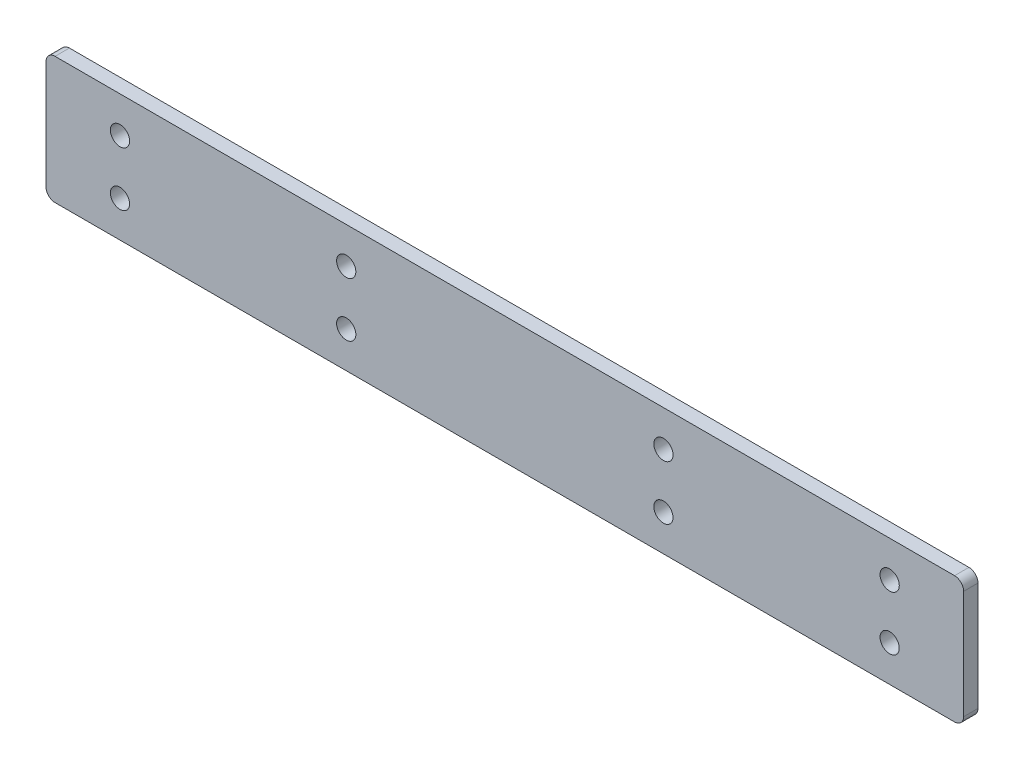
ISO-10303-21;
HEADER;
FILE_DESCRIPTION(('STEP AP214'),'2;1');
FILE_NAME('part.step','',(''),(''),'','','');
FILE_SCHEMA(('AUTOMOTIVE_DESIGN { 1 0 10303 214 1 1 1 1 }'));
ENDSEC;
DATA;
#1=APPLICATION_CONTEXT('core data for automotive mechanical design processes');
#2=APPLICATION_PROTOCOL_DEFINITION('international standard','automotive_design',2000,#1);
#3=PRODUCT_CONTEXT('',#1,'mechanical');
#4=PRODUCT('Part','Part','',(#3));
#5=PRODUCT_RELATED_PRODUCT_CATEGORY('part','',(#4));
#6=PRODUCT_DEFINITION_FORMATION('','',#4);
#7=PRODUCT_DEFINITION_CONTEXT('part definition',#1,'design');
#8=PRODUCT_DEFINITION('design','',#6,#7);
#9=PRODUCT_DEFINITION_SHAPE('','',#8);
#10=(LENGTH_UNIT() NAMED_UNIT(*) SI_UNIT(.MILLI.,.METRE.));
#11=(NAMED_UNIT(*) PLANE_ANGLE_UNIT() SI_UNIT($,.RADIAN.));
#12=(NAMED_UNIT(*) SI_UNIT($,.STERADIAN.) SOLID_ANGLE_UNIT());
#13=UNCERTAINTY_MEASURE_WITH_UNIT(LENGTH_MEASURE(1.E-05),#10,'distance_accuracy_value','');
#14=(GEOMETRIC_REPRESENTATION_CONTEXT(3) GLOBAL_UNCERTAINTY_ASSIGNED_CONTEXT((#13)) GLOBAL_UNIT_ASSIGNED_CONTEXT((#10,
#11,#12)) REPRESENTATION_CONTEXT('',''));
#15=CARTESIAN_POINT('',(0.,0.,0.));
#16=DIRECTION('',(0.,0.,1.));
#17=DIRECTION('',(1.,0.,0.));
#18=AXIS2_PLACEMENT_3D('',#15,#16,#17);
#19=CARTESIAN_POINT('',(0.,0.,3.175));
#20=DIRECTION('',(0.,0.,-1.));
#21=DIRECTION('',(-1.,0.,0.));
#22=AXIS2_PLACEMENT_3D('',#19,#20,#21);
#23=PLANE('',#22);
#24=DIRECTION('',(1.,0.,0.));
#25=VECTOR('',#24,1.);
#26=CARTESIAN_POINT('',(-101.4,-14.,3.175));
#27=LINE('',#26,#25);
#28=CARTESIAN_POINT('',(-99.4,-14.,3.175));
#29=VERTEX_POINT('',#28);
#30=CARTESIAN_POINT('',(99.3999999999999,-14.,3.175));
#31=VERTEX_POINT('',#30);
#32=EDGE_CURVE('E152',#29,#31,#27,.T.);
#33=ORIENTED_EDGE('',*,*,#32,.T.);
#34=CARTESIAN_POINT('',(99.4,-12.,3.175));
#35=DIRECTION('',(0.,0.,-1.));
#36=DIRECTION('',(-1.,0.,0.));
#37=AXIS2_PLACEMENT_3D('',#34,#35,#36);
#38=CIRCLE('',#37,2.);
#39=CARTESIAN_POINT('',(101.4,-12.,3.175));
#40=VERTEX_POINT('',#39);
#41=EDGE_CURVE('E182',#31,#40,#38,.F.);
#42=ORIENTED_EDGE('',*,*,#41,.T.);
#43=DIRECTION('',(0.,1.,0.));
#44=VECTOR('',#43,1.);
#45=CARTESIAN_POINT('',(101.4,-14.,3.175));
#46=LINE('',#45,#44);
#47=CARTESIAN_POINT('',(101.4,12.,3.175));
#48=VERTEX_POINT('',#47);
#49=EDGE_CURVE('E131',#40,#48,#46,.T.);
#50=ORIENTED_EDGE('',*,*,#49,.T.);
#51=CARTESIAN_POINT('',(99.4,12.,3.175));
#52=DIRECTION('',(0.,0.,-1.));
#53=DIRECTION('',(-1.,0.,0.));
#54=AXIS2_PLACEMENT_3D('',#51,#52,#53);
#55=CIRCLE('',#54,2.);
#56=CARTESIAN_POINT('',(99.3999999999999,14.,3.175));
#57=VERTEX_POINT('',#56);
#58=EDGE_CURVE('E179',#48,#57,#55,.F.);
#59=ORIENTED_EDGE('',*,*,#58,.T.);
#60=DIRECTION('',(-1.,0.,0.));
#61=VECTOR('',#60,1.);
#62=CARTESIAN_POINT('',(-101.4,14.,3.175));
#63=LINE('',#62,#61);
#64=CARTESIAN_POINT('',(-99.4,14.,3.175));
#65=VERTEX_POINT('',#64);
#66=EDGE_CURVE('E208',#57,#65,#63,.T.);
#67=ORIENTED_EDGE('',*,*,#66,.T.);
#68=CARTESIAN_POINT('',(-99.4,12.,3.175));
#69=DIRECTION('',(0.,0.,-1.));
#70=DIRECTION('',(-1.,0.,0.));
#71=AXIS2_PLACEMENT_3D('',#68,#69,#70);
#72=CIRCLE('',#71,2.);
#73=CARTESIAN_POINT('',(-101.4,12.,3.175));
#74=VERTEX_POINT('',#73);
#75=EDGE_CURVE('E65',#65,#74,#72,.F.);
#76=ORIENTED_EDGE('',*,*,#75,.T.);
#77=DIRECTION('',(0.,-1.,0.));
#78=VECTOR('',#77,1.);
#79=CARTESIAN_POINT('',(-101.4,-14.,3.175));
#80=LINE('',#79,#78);
#81=CARTESIAN_POINT('',(-101.4,-12.,3.175));
#82=VERTEX_POINT('',#81);
#83=EDGE_CURVE('E196',#74,#82,#80,.T.);
#84=ORIENTED_EDGE('',*,*,#83,.T.);
#85=CARTESIAN_POINT('',(-99.4,-12.,3.175));
#86=DIRECTION('',(0.,0.,-1.));
#87=DIRECTION('',(-1.,0.,0.));
#88=AXIS2_PLACEMENT_3D('',#85,#86,#87);
#89=CIRCLE('',#88,2.);
#90=EDGE_CURVE('E176',#82,#29,#89,.F.);
#91=ORIENTED_EDGE('',*,*,#90,.T.);
#92=EDGE_LOOP('',(#33,#42,#50,#59,#67,#76,#84,#91));
#93=FACE_BOUND('',#92,.T.);
#94=CARTESIAN_POINT('',(85.05,6.,3.175));
#95=DIRECTION('',(0.,0.,1.));
#96=DIRECTION('',(1.,0.,0.));
#97=AXIS2_PLACEMENT_3D('',#94,#95,#96);
#98=CIRCLE('',#97,2.125);
#99=CARTESIAN_POINT('',(87.175,6.,3.175));
#100=VERTEX_POINT('',#99);
#101=EDGE_CURVE('E141',#100,#100,#98,.T.);
#102=ORIENTED_EDGE('',*,*,#101,.F.);
#103=EDGE_LOOP('',(#102));
#104=FACE_BOUND('',#103,.T.);
#105=CARTESIAN_POINT('',(85.05,-6.,3.175));
#106=DIRECTION('',(0.,0.,1.));
#107=DIRECTION('',(-1.,0.,0.));
#108=AXIS2_PLACEMENT_3D('',#105,#106,#107);
#109=CIRCLE('',#108,2.125);
#110=CARTESIAN_POINT('',(82.925,-6.,3.175));
#111=VERTEX_POINT('',#110);
#112=EDGE_CURVE('E216',#111,#111,#109,.T.);
#113=ORIENTED_EDGE('',*,*,#112,.F.);
#114=EDGE_LOOP('',(#113));
#115=FACE_BOUND('',#114,.T.);
#116=CARTESIAN_POINT('',(-85.05,-6.00000000000002,3.175));
#117=DIRECTION('',(0.,0.,1.));
#118=DIRECTION('',(1.,0.,0.));
#119=AXIS2_PLACEMENT_3D('',#116,#117,#118);
#120=CIRCLE('',#119,2.125);
#121=CARTESIAN_POINT('',(-82.925,-6.00000000000002,3.175));
#122=VERTEX_POINT('',#121);
#123=EDGE_CURVE('E222',#122,#122,#120,.T.);
#124=ORIENTED_EDGE('',*,*,#123,.F.);
#125=EDGE_LOOP('',(#124));
#126=FACE_BOUND('',#125,.T.);
#127=CARTESIAN_POINT('',(-85.05,5.99999999999998,3.175));
#128=DIRECTION('',(0.,0.,1.));
#129=DIRECTION('',(-1.,0.,0.));
#130=AXIS2_PLACEMENT_3D('',#127,#128,#129);
#131=CIRCLE('',#130,2.125);
#132=CARTESIAN_POINT('',(-87.175,5.99999999999998,3.175));
#133=VERTEX_POINT('',#132);
#134=EDGE_CURVE('E230',#133,#133,#131,.T.);
#135=ORIENTED_EDGE('',*,*,#134,.F.);
#136=EDGE_LOOP('',(#135));
#137=FACE_BOUND('',#136,.T.);
#138=CARTESIAN_POINT('',(-35.05,5.99999999999998,3.175));
#139=DIRECTION('',(0.,0.,1.));
#140=DIRECTION('',(1.,0.,0.));
#141=AXIS2_PLACEMENT_3D('',#138,#139,#140);
#142=CIRCLE('',#141,2.125);
#143=CARTESIAN_POINT('',(-32.925,5.99999999999998,3.175));
#144=VERTEX_POINT('',#143);
#145=EDGE_CURVE('E238',#144,#144,#142,.T.);
#146=ORIENTED_EDGE('',*,*,#145,.F.);
#147=EDGE_LOOP('',(#146));
#148=FACE_BOUND('',#147,.T.);
#149=CARTESIAN_POINT('',(-35.05,-5.99999999999998,3.175));
#150=DIRECTION('',(0.,0.,1.));
#151=DIRECTION('',(-1.,0.,0.));
#152=AXIS2_PLACEMENT_3D('',#149,#150,#151);
#153=CIRCLE('',#152,2.125);
#154=CARTESIAN_POINT('',(-37.175,-5.99999999999998,3.175));
#155=VERTEX_POINT('',#154);
#156=EDGE_CURVE('E246',#155,#155,#153,.T.);
#157=ORIENTED_EDGE('',*,*,#156,.F.);
#158=EDGE_LOOP('',(#157));
#159=FACE_BOUND('',#158,.T.);
#160=CARTESIAN_POINT('',(35.05,-5.99999999999997,3.175));
#161=DIRECTION('',(0.,0.,1.));
#162=DIRECTION('',(1.,0.,0.));
#163=AXIS2_PLACEMENT_3D('',#160,#161,#162);
#164=CIRCLE('',#163,2.125);
#165=CARTESIAN_POINT('',(37.175,-5.99999999999997,3.175));
#166=VERTEX_POINT('',#165);
#167=EDGE_CURVE('E254',#166,#166,#164,.T.);
#168=ORIENTED_EDGE('',*,*,#167,.F.);
#169=EDGE_LOOP('',(#168));
#170=FACE_BOUND('',#169,.T.);
#171=CARTESIAN_POINT('',(35.05,5.99999999999999,3.175));
#172=DIRECTION('',(0.,0.,1.));
#173=DIRECTION('',(-1.,0.,0.));
#174=AXIS2_PLACEMENT_3D('',#171,#172,#173);
#175=CIRCLE('',#174,2.125);
#176=CARTESIAN_POINT('',(32.925,5.99999999999999,3.175));
#177=VERTEX_POINT('',#176);
#178=EDGE_CURVE('E262',#177,#177,#175,.T.);
#179=ORIENTED_EDGE('',*,*,#178,.F.);
#180=EDGE_LOOP('',(#179));
#181=FACE_BOUND('',#180,.T.);
#182=ADVANCED_FACE('F44',(#93,#104,#115,#126,#137,#148,#159,#170,#181),#23,.F.);
#183=CARTESIAN_POINT('',(0.,0.,0.));
#184=DIRECTION('',(0.,0.,-1.));
#185=DIRECTION('',(-1.,0.,0.));
#186=AXIS2_PLACEMENT_3D('',#183,#184,#185);
#187=PLANE('',#186);
#188=CARTESIAN_POINT('',(35.05,-5.99999999999997,0.));
#189=DIRECTION('',(0.,0.,1.));
#190=DIRECTION('',(1.,0.,0.));
#191=AXIS2_PLACEMENT_3D('',#188,#189,#190);
#192=CIRCLE('',#191,2.125);
#193=CARTESIAN_POINT('',(37.175,-5.99999999999997,0.));
#194=VERTEX_POINT('',#193);
#195=EDGE_CURVE('E258',#194,#194,#192,.T.);
#196=ORIENTED_EDGE('',*,*,#195,.T.);
#197=EDGE_LOOP('',(#196));
#198=FACE_BOUND('',#197,.T.);
#199=CARTESIAN_POINT('',(-35.05,5.99999999999998,0.));
#200=DIRECTION('',(0.,0.,1.));
#201=DIRECTION('',(1.,0.,0.));
#202=AXIS2_PLACEMENT_3D('',#199,#200,#201);
#203=CIRCLE('',#202,2.125);
#204=CARTESIAN_POINT('',(-32.925,5.99999999999998,0.));
#205=VERTEX_POINT('',#204);
#206=EDGE_CURVE('E242',#205,#205,#203,.T.);
#207=ORIENTED_EDGE('',*,*,#206,.T.);
#208=EDGE_LOOP('',(#207));
#209=FACE_BOUND('',#208,.T.);
#210=CARTESIAN_POINT('',(-85.05,-6.00000000000002,0.));
#211=DIRECTION('',(0.,0.,1.));
#212=DIRECTION('',(1.,0.,0.));
#213=AXIS2_PLACEMENT_3D('',#210,#211,#212);
#214=CIRCLE('',#213,2.125);
#215=CARTESIAN_POINT('',(-82.925,-6.00000000000002,0.));
#216=VERTEX_POINT('',#215);
#217=EDGE_CURVE('E226',#216,#216,#214,.T.);
#218=ORIENTED_EDGE('',*,*,#217,.T.);
#219=EDGE_LOOP('',(#218));
#220=FACE_BOUND('',#219,.T.);
#221=CARTESIAN_POINT('',(85.05,6.,0.));
#222=DIRECTION('',(0.,0.,1.));
#223=DIRECTION('',(1.,0.,0.));
#224=AXIS2_PLACEMENT_3D('',#221,#222,#223);
#225=CIRCLE('',#224,2.125);
#226=CARTESIAN_POINT('',(87.175,6.,0.));
#227=VERTEX_POINT('',#226);
#228=EDGE_CURVE('E149',#227,#227,#225,.T.);
#229=ORIENTED_EDGE('',*,*,#228,.T.);
#230=EDGE_LOOP('',(#229));
#231=FACE_BOUND('',#230,.T.);
#232=DIRECTION('',(0.,1.,0.));
#233=VECTOR('',#232,1.);
#234=CARTESIAN_POINT('',(101.4,-14.,0.));
#235=LINE('',#234,#233);
#236=CARTESIAN_POINT('',(101.4,-12.,0.));
#237=VERTEX_POINT('',#236);
#238=CARTESIAN_POINT('',(101.4,12.,0.));
#239=VERTEX_POINT('',#238);
#240=EDGE_CURVE('E128',#237,#239,#235,.T.);
#241=ORIENTED_EDGE('',*,*,#240,.F.);
#242=CARTESIAN_POINT('',(99.4,-12.,0.));
#243=DIRECTION('',(0.,0.,-1.));
#244=DIRECTION('',(-1.,0.,0.));
#245=AXIS2_PLACEMENT_3D('',#242,#243,#244);
#246=CIRCLE('',#245,2.);
#247=CARTESIAN_POINT('',(99.3999999999999,-14.,0.));
#248=VERTEX_POINT('',#247);
#249=EDGE_CURVE('E110',#237,#248,#246,.T.);
#250=ORIENTED_EDGE('',*,*,#249,.T.);
#251=DIRECTION('',(1.,0.,0.));
#252=VECTOR('',#251,1.);
#253=CARTESIAN_POINT('',(-101.4,-14.,0.));
#254=LINE('',#253,#252);
#255=CARTESIAN_POINT('',(-99.4,-14.,0.));
#256=VERTEX_POINT('',#255);
#257=EDGE_CURVE('E157',#256,#248,#254,.T.);
#258=ORIENTED_EDGE('',*,*,#257,.F.);
#259=CARTESIAN_POINT('',(-99.4,-12.,0.));
#260=DIRECTION('',(0.,0.,-1.));
#261=DIRECTION('',(-1.,0.,0.));
#262=AXIS2_PLACEMENT_3D('',#259,#260,#261);
#263=CIRCLE('',#262,2.);
#264=CARTESIAN_POINT('',(-101.4,-12.,0.));
#265=VERTEX_POINT('',#264);
#266=EDGE_CURVE('E164',#256,#265,#263,.T.);
#267=ORIENTED_EDGE('',*,*,#266,.T.);
#268=DIRECTION('',(0.,-1.,0.));
#269=VECTOR('',#268,1.);
#270=CARTESIAN_POINT('',(-101.4,-14.,0.));
#271=LINE('',#270,#269);
#272=CARTESIAN_POINT('',(-101.4,12.,0.));
#273=VERTEX_POINT('',#272);
#274=EDGE_CURVE('E146',#273,#265,#271,.T.);
#275=ORIENTED_EDGE('',*,*,#274,.F.);
#276=CARTESIAN_POINT('',(-99.4,12.,0.));
#277=DIRECTION('',(0.,0.,-1.));
#278=DIRECTION('',(-1.,0.,0.));
#279=AXIS2_PLACEMENT_3D('',#276,#277,#278);
#280=CIRCLE('',#279,2.);
#281=CARTESIAN_POINT('',(-99.4,14.,0.));
#282=VERTEX_POINT('',#281);
#283=EDGE_CURVE('E133',#273,#282,#280,.T.);
#284=ORIENTED_EDGE('',*,*,#283,.T.);
#285=DIRECTION('',(-1.,0.,0.));
#286=VECTOR('',#285,1.);
#287=CARTESIAN_POINT('',(-101.4,14.,0.));
#288=LINE('',#287,#286);
#289=CARTESIAN_POINT('',(99.3999999999999,14.,0.));
#290=VERTEX_POINT('',#289);
#291=EDGE_CURVE('E140',#290,#282,#288,.T.);
#292=ORIENTED_EDGE('',*,*,#291,.F.);
#293=CARTESIAN_POINT('',(99.4,12.,0.));
#294=DIRECTION('',(0.,0.,-1.));
#295=DIRECTION('',(-1.,0.,0.));
#296=AXIS2_PLACEMENT_3D('',#293,#294,#295);
#297=CIRCLE('',#296,2.);
#298=EDGE_CURVE('E122',#290,#239,#297,.T.);
#299=ORIENTED_EDGE('',*,*,#298,.T.);
#300=EDGE_LOOP('',(#241,#250,#258,#267,#275,#284,#292,#299));
#301=FACE_BOUND('',#300,.T.);
#302=CARTESIAN_POINT('',(85.05,-6.,0.));
#303=DIRECTION('',(0.,0.,1.));
#304=DIRECTION('',(-1.,0.,0.));
#305=AXIS2_PLACEMENT_3D('',#302,#303,#304);
#306=CIRCLE('',#305,2.125);
#307=CARTESIAN_POINT('',(82.925,-6.,0.));
#308=VERTEX_POINT('',#307);
#309=EDGE_CURVE('E218',#308,#308,#306,.T.);
#310=ORIENTED_EDGE('',*,*,#309,.T.);
#311=EDGE_LOOP('',(#310));
#312=FACE_BOUND('',#311,.T.);
#313=CARTESIAN_POINT('',(-85.05,5.99999999999998,0.));
#314=DIRECTION('',(0.,0.,1.));
#315=DIRECTION('',(-1.,0.,0.));
#316=AXIS2_PLACEMENT_3D('',#313,#314,#315);
#317=CIRCLE('',#316,2.125);
#318=CARTESIAN_POINT('',(-87.175,5.99999999999998,0.));
#319=VERTEX_POINT('',#318);
#320=EDGE_CURVE('E234',#319,#319,#317,.T.);
#321=ORIENTED_EDGE('',*,*,#320,.T.);
#322=EDGE_LOOP('',(#321));
#323=FACE_BOUND('',#322,.T.);
#324=CARTESIAN_POINT('',(-35.05,-5.99999999999998,0.));
#325=DIRECTION('',(0.,0.,1.));
#326=DIRECTION('',(-1.,0.,0.));
#327=AXIS2_PLACEMENT_3D('',#324,#325,#326);
#328=CIRCLE('',#327,2.125);
#329=CARTESIAN_POINT('',(-37.175,-5.99999999999998,0.));
#330=VERTEX_POINT('',#329);
#331=EDGE_CURVE('E250',#330,#330,#328,.T.);
#332=ORIENTED_EDGE('',*,*,#331,.T.);
#333=EDGE_LOOP('',(#332));
#334=FACE_BOUND('',#333,.T.);
#335=CARTESIAN_POINT('',(35.05,5.99999999999999,0.));
#336=DIRECTION('',(0.,0.,1.));
#337=DIRECTION('',(-1.,0.,0.));
#338=AXIS2_PLACEMENT_3D('',#335,#336,#337);
#339=CIRCLE('',#338,2.125);
#340=CARTESIAN_POINT('',(32.925,5.99999999999999,0.));
#341=VERTEX_POINT('',#340);
#342=EDGE_CURVE('E266',#341,#341,#339,.T.);
#343=ORIENTED_EDGE('',*,*,#342,.T.);
#344=EDGE_LOOP('',(#343));
#345=FACE_BOUND('',#344,.T.);
#346=ADVANCED_FACE('F136',(#198,#209,#220,#231,#301,#312,#323,#334,#345),#187,.T.);
#347=CARTESIAN_POINT('',(101.4,-14.,3.175));
#348=DIRECTION('',(-1.,0.,0.));
#349=DIRECTION('',(0.,0.,1.));
#350=AXIS2_PLACEMENT_3D('',#347,#348,#349);
#351=PLANE('',#350);
#352=ORIENTED_EDGE('',*,*,#49,.F.);
#353=DIRECTION('',(0.,0.,-1.));
#354=VECTOR('',#353,1.);
#355=CARTESIAN_POINT('',(101.4,-12.,3.175));
#356=LINE('',#355,#354);
#357=EDGE_CURVE('E114',#40,#237,#356,.T.);
#358=ORIENTED_EDGE('',*,*,#357,.T.);
#359=ORIENTED_EDGE('',*,*,#240,.T.);
#360=DIRECTION('',(0.,0.,-1.));
#361=VECTOR('',#360,1.);
#362=CARTESIAN_POINT('',(101.4,12.,3.175));
#363=LINE('',#362,#361);
#364=EDGE_CURVE('E134',#239,#48,#363,.F.);
#365=ORIENTED_EDGE('',*,*,#364,.T.);
#366=EDGE_LOOP('',(#352,#358,#359,#365));
#367=FACE_BOUND('',#366,.T.);
#368=ADVANCED_FACE('F127',(#367),#351,.F.);
#369=CARTESIAN_POINT('',(-101.4,14.,3.175));
#370=DIRECTION('',(0.,-1.,0.));
#371=DIRECTION('',(1.,0.,0.));
#372=AXIS2_PLACEMENT_3D('',#369,#370,#371);
#373=PLANE('',#372);
#374=ORIENTED_EDGE('',*,*,#66,.F.);
#375=DIRECTION('',(0.,0.,-1.));
#376=VECTOR('',#375,1.);
#377=CARTESIAN_POINT('',(99.4,14.,3.175));
#378=LINE('',#377,#376);
#379=EDGE_CURVE('E188',#57,#290,#378,.T.);
#380=ORIENTED_EDGE('',*,*,#379,.T.);
#381=ORIENTED_EDGE('',*,*,#291,.T.);
#382=DIRECTION('',(0.,0.,-1.));
#383=VECTOR('',#382,1.);
#384=CARTESIAN_POINT('',(-99.4,14.,3.175));
#385=LINE('',#384,#383);
#386=EDGE_CURVE('E185',#282,#65,#385,.F.);
#387=ORIENTED_EDGE('',*,*,#386,.T.);
#388=EDGE_LOOP('',(#374,#380,#381,#387));
#389=FACE_BOUND('',#388,.T.);
#390=ADVANCED_FACE('F294',(#389),#373,.F.);
#391=CARTESIAN_POINT('',(-101.4,-14.,3.175));
#392=DIRECTION('',(1.,0.,0.));
#393=DIRECTION('',(0.,0.,-1.));
#394=AXIS2_PLACEMENT_3D('',#391,#392,#393);
#395=PLANE('',#394);
#396=ORIENTED_EDGE('',*,*,#274,.T.);
#397=DIRECTION('',(0.,0.,-1.));
#398=VECTOR('',#397,1.);
#399=CARTESIAN_POINT('',(-101.4,-12.,3.175));
#400=LINE('',#399,#398);
#401=EDGE_CURVE('E11',#265,#82,#400,.F.);
#402=ORIENTED_EDGE('',*,*,#401,.T.);
#403=ORIENTED_EDGE('',*,*,#83,.F.);
#404=DIRECTION('',(0.,0.,-1.));
#405=VECTOR('',#404,1.);
#406=CARTESIAN_POINT('',(-101.4,12.,3.175));
#407=LINE('',#406,#405);
#408=EDGE_CURVE('E53',#74,#273,#407,.T.);
#409=ORIENTED_EDGE('',*,*,#408,.T.);
#410=EDGE_LOOP('',(#396,#402,#403,#409));
#411=FACE_BOUND('',#410,.T.);
#412=ADVANCED_FACE('F195',(#411),#395,.F.);
#413=CARTESIAN_POINT('',(-101.4,-14.,3.175));
#414=DIRECTION('',(0.,1.,0.));
#415=DIRECTION('',(-1.,0.,0.));
#416=AXIS2_PLACEMENT_3D('',#413,#414,#415);
#417=PLANE('',#416);
#418=ORIENTED_EDGE('',*,*,#257,.T.);
#419=DIRECTION('',(0.,0.,-1.));
#420=VECTOR('',#419,1.);
#421=CARTESIAN_POINT('',(99.4,-14.,3.175));
#422=LINE('',#421,#420);
#423=EDGE_CURVE('E115',#248,#31,#422,.F.);
#424=ORIENTED_EDGE('',*,*,#423,.T.);
#425=ORIENTED_EDGE('',*,*,#32,.F.);
#426=DIRECTION('',(0.,0.,-1.));
#427=VECTOR('',#426,1.);
#428=CARTESIAN_POINT('',(-99.4,-14.,3.175));
#429=LINE('',#428,#427);
#430=EDGE_CURVE('E121',#29,#256,#429,.T.);
#431=ORIENTED_EDGE('',*,*,#430,.T.);
#432=EDGE_LOOP('',(#418,#424,#425,#431));
#433=FACE_BOUND('',#432,.T.);
#434=ADVANCED_FACE('F204',(#433),#417,.F.);
#435=CARTESIAN_POINT('',(85.05,6.,3.175));
#436=DIRECTION('',(0.,0.,-1.));
#437=DIRECTION('',(-1.,0.,0.));
#438=AXIS2_PLACEMENT_3D('',#435,#436,#437);
#439=CYLINDRICAL_SURFACE('',#438,2.125);
#440=ORIENTED_EDGE('',*,*,#101,.T.);
#441=EDGE_LOOP('',(#440));
#442=FACE_BOUND('',#441,.T.);
#443=ORIENTED_EDGE('',*,*,#228,.F.);
#444=EDGE_LOOP('',(#443));
#445=FACE_BOUND('',#444,.T.);
#446=ADVANCED_FACE('F287',(#442,#445),#439,.F.);
#447=CARTESIAN_POINT('',(85.05,-6.,3.175));
#448=DIRECTION('',(0.,0.,-1.));
#449=DIRECTION('',(-1.,0.,0.));
#450=AXIS2_PLACEMENT_3D('',#447,#448,#449);
#451=CYLINDRICAL_SURFACE('',#450,2.125);
#452=ORIENTED_EDGE('',*,*,#112,.T.);
#453=EDGE_LOOP('',(#452));
#454=FACE_BOUND('',#453,.T.);
#455=ORIENTED_EDGE('',*,*,#309,.F.);
#456=EDGE_LOOP('',(#455));
#457=FACE_BOUND('',#456,.T.);
#458=ADVANCED_FACE('F389',(#454,#457),#451,.F.);
#459=CARTESIAN_POINT('',(-85.05,-6.00000000000002,3.175));
#460=DIRECTION('',(0.,0.,-1.));
#461=DIRECTION('',(-1.,0.,0.));
#462=AXIS2_PLACEMENT_3D('',#459,#460,#461);
#463=CYLINDRICAL_SURFACE('',#462,2.125);
#464=ORIENTED_EDGE('',*,*,#123,.T.);
#465=EDGE_LOOP('',(#464));
#466=FACE_BOUND('',#465,.T.);
#467=ORIENTED_EDGE('',*,*,#217,.F.);
#468=EDGE_LOOP('',(#467));
#469=FACE_BOUND('',#468,.T.);
#470=ADVANCED_FACE('F379',(#466,#469),#463,.F.);
#471=CARTESIAN_POINT('',(-85.05,5.99999999999998,3.175));
#472=DIRECTION('',(0.,0.,-1.));
#473=DIRECTION('',(-1.,0.,0.));
#474=AXIS2_PLACEMENT_3D('',#471,#472,#473);
#475=CYLINDRICAL_SURFACE('',#474,2.125);
#476=ORIENTED_EDGE('',*,*,#134,.T.);
#477=EDGE_LOOP('',(#476));
#478=FACE_BOUND('',#477,.T.);
#479=ORIENTED_EDGE('',*,*,#320,.F.);
#480=EDGE_LOOP('',(#479));
#481=FACE_BOUND('',#480,.T.);
#482=ADVANCED_FACE('F369',(#478,#481),#475,.F.);
#483=CARTESIAN_POINT('',(-35.05,5.99999999999998,3.175));
#484=DIRECTION('',(0.,0.,-1.));
#485=DIRECTION('',(-1.,0.,0.));
#486=AXIS2_PLACEMENT_3D('',#483,#484,#485);
#487=CYLINDRICAL_SURFACE('',#486,2.125);
#488=ORIENTED_EDGE('',*,*,#145,.T.);
#489=EDGE_LOOP('',(#488));
#490=FACE_BOUND('',#489,.T.);
#491=ORIENTED_EDGE('',*,*,#206,.F.);
#492=EDGE_LOOP('',(#491));
#493=FACE_BOUND('',#492,.T.);
#494=ADVANCED_FACE('F359',(#490,#493),#487,.F.);
#495=CARTESIAN_POINT('',(-35.05,-5.99999999999998,3.175));
#496=DIRECTION('',(0.,0.,-1.));
#497=DIRECTION('',(-1.,0.,0.));
#498=AXIS2_PLACEMENT_3D('',#495,#496,#497);
#499=CYLINDRICAL_SURFACE('',#498,2.125);
#500=ORIENTED_EDGE('',*,*,#156,.T.);
#501=EDGE_LOOP('',(#500));
#502=FACE_BOUND('',#501,.T.);
#503=ORIENTED_EDGE('',*,*,#331,.F.);
#504=EDGE_LOOP('',(#503));
#505=FACE_BOUND('',#504,.T.);
#506=ADVANCED_FACE('F349',(#502,#505),#499,.F.);
#507=CARTESIAN_POINT('',(35.05,-5.99999999999997,3.175));
#508=DIRECTION('',(0.,0.,-1.));
#509=DIRECTION('',(-1.,0.,0.));
#510=AXIS2_PLACEMENT_3D('',#507,#508,#509);
#511=CYLINDRICAL_SURFACE('',#510,2.125);
#512=ORIENTED_EDGE('',*,*,#167,.T.);
#513=EDGE_LOOP('',(#512));
#514=FACE_BOUND('',#513,.T.);
#515=ORIENTED_EDGE('',*,*,#195,.F.);
#516=EDGE_LOOP('',(#515));
#517=FACE_BOUND('',#516,.T.);
#518=ADVANCED_FACE('F340',(#514,#517),#511,.F.);
#519=CARTESIAN_POINT('',(35.05,5.99999999999999,3.175));
#520=DIRECTION('',(0.,0.,-1.));
#521=DIRECTION('',(-1.,0.,0.));
#522=AXIS2_PLACEMENT_3D('',#519,#520,#521);
#523=CYLINDRICAL_SURFACE('',#522,2.125);
#524=ORIENTED_EDGE('',*,*,#178,.T.);
#525=EDGE_LOOP('',(#524));
#526=FACE_BOUND('',#525,.T.);
#527=ORIENTED_EDGE('',*,*,#342,.F.);
#528=EDGE_LOOP('',(#527));
#529=FACE_BOUND('',#528,.T.);
#530=ADVANCED_FACE('F274',(#526,#529),#523,.F.);
#531=CARTESIAN_POINT('',(99.4,-12.,3.175));
#532=DIRECTION('',(0.,0.,-1.));
#533=DIRECTION('',(-1.,0.,0.));
#534=AXIS2_PLACEMENT_3D('',#531,#532,#533);
#535=CYLINDRICAL_SURFACE('',#534,2.);
#536=ORIENTED_EDGE('',*,*,#41,.F.);
#537=ORIENTED_EDGE('',*,*,#423,.F.);
#538=ORIENTED_EDGE('',*,*,#249,.F.);
#539=ORIENTED_EDGE('',*,*,#357,.F.);
#540=EDGE_LOOP('',(#536,#537,#538,#539));
#541=FACE_BOUND('',#540,.T.);
#542=ADVANCED_FACE('F113',(#541),#535,.T.);
#543=CARTESIAN_POINT('',(99.4,12.,3.175));
#544=DIRECTION('',(0.,0.,-1.));
#545=DIRECTION('',(-1.,0.,0.));
#546=AXIS2_PLACEMENT_3D('',#543,#544,#545);
#547=CYLINDRICAL_SURFACE('',#546,2.);
#548=ORIENTED_EDGE('',*,*,#58,.F.);
#549=ORIENTED_EDGE('',*,*,#364,.F.);
#550=ORIENTED_EDGE('',*,*,#298,.F.);
#551=ORIENTED_EDGE('',*,*,#379,.F.);
#552=EDGE_LOOP('',(#548,#549,#550,#551));
#553=FACE_BOUND('',#552,.T.);
#554=ADVANCED_FACE('F302',(#553),#547,.T.);
#555=CARTESIAN_POINT('',(-99.4,-12.,3.175));
#556=DIRECTION('',(0.,0.,-1.));
#557=DIRECTION('',(-1.,0.,0.));
#558=AXIS2_PLACEMENT_3D('',#555,#556,#557);
#559=CYLINDRICAL_SURFACE('',#558,2.);
#560=ORIENTED_EDGE('',*,*,#90,.F.);
#561=ORIENTED_EDGE('',*,*,#401,.F.);
#562=ORIENTED_EDGE('',*,*,#266,.F.);
#563=ORIENTED_EDGE('',*,*,#430,.F.);
#564=EDGE_LOOP('',(#560,#561,#562,#563));
#565=FACE_BOUND('',#564,.T.);
#566=ADVANCED_FACE('F201',(#565),#559,.T.);
#567=CARTESIAN_POINT('',(-99.4,12.,3.175));
#568=DIRECTION('',(0.,0.,-1.));
#569=DIRECTION('',(-1.,0.,0.));
#570=AXIS2_PLACEMENT_3D('',#567,#568,#569);
#571=CYLINDRICAL_SURFACE('',#570,2.);
#572=ORIENTED_EDGE('',*,*,#75,.F.);
#573=ORIENTED_EDGE('',*,*,#386,.F.);
#574=ORIENTED_EDGE('',*,*,#283,.F.);
#575=ORIENTED_EDGE('',*,*,#408,.F.);
#576=EDGE_LOOP('',(#572,#573,#574,#575));
#577=FACE_BOUND('',#576,.T.);
#578=ADVANCED_FACE('F46',(#577),#571,.T.);
#579=CLOSED_SHELL('',(#182,#346,#368,#390,#412,#434,#446,#458,#470,#482,#494,#506,#518,#530,
#542,#554,#566,#578));
#580=MANIFOLD_SOLID_BREP('B2',#579);
#581=ADVANCED_BREP_SHAPE_REPRESENTATION('',(#18,#580),#14);
#582=SHAPE_DEFINITION_REPRESENTATION(#9,#581);
ENDSEC;
END-ISO-10303-21;
